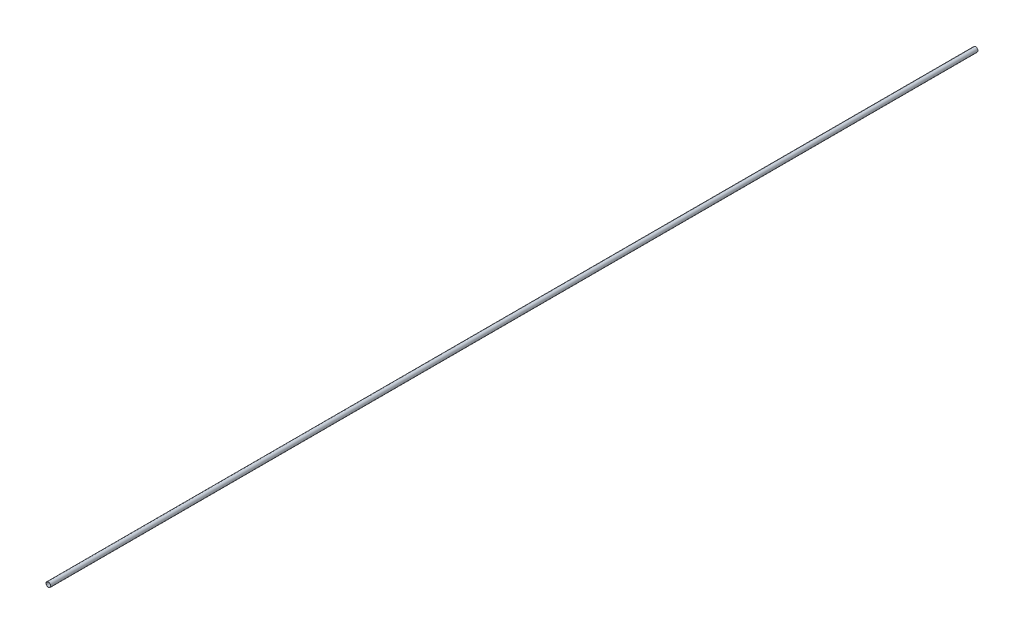
ISO-10303-21;
HEADER;
FILE_DESCRIPTION(('STEP AP214'),'2;1');
FILE_NAME('part.step','',(''),(''),'','','');
FILE_SCHEMA(('AUTOMOTIVE_DESIGN { 1 0 10303 214 1 1 1 1 }'));
ENDSEC;
DATA;
#1=APPLICATION_CONTEXT('core data for automotive mechanical design processes');
#2=APPLICATION_PROTOCOL_DEFINITION('international standard','automotive_design',2000,#1);
#3=PRODUCT_CONTEXT('',#1,'mechanical');
#4=PRODUCT('Part','Part','',(#3));
#5=PRODUCT_RELATED_PRODUCT_CATEGORY('part','',(#4));
#6=PRODUCT_DEFINITION_FORMATION('','',#4);
#7=PRODUCT_DEFINITION_CONTEXT('part definition',#1,'design');
#8=PRODUCT_DEFINITION('design','',#6,#7);
#9=PRODUCT_DEFINITION_SHAPE('','',#8);
#10=(LENGTH_UNIT() NAMED_UNIT(*) SI_UNIT(.MILLI.,.METRE.));
#11=(NAMED_UNIT(*) PLANE_ANGLE_UNIT() SI_UNIT($,.RADIAN.));
#12=(NAMED_UNIT(*) SI_UNIT($,.STERADIAN.) SOLID_ANGLE_UNIT());
#13=UNCERTAINTY_MEASURE_WITH_UNIT(LENGTH_MEASURE(1.E-05),#10,'distance_accuracy_value','');
#14=(GEOMETRIC_REPRESENTATION_CONTEXT(3) GLOBAL_UNCERTAINTY_ASSIGNED_CONTEXT((#13)) GLOBAL_UNIT_ASSIGNED_CONTEXT((#10,
#11,#12)) REPRESENTATION_CONTEXT('',''));
#15=CARTESIAN_POINT('',(0.,0.,0.));
#16=DIRECTION('',(0.,0.,1.));
#17=DIRECTION('',(1.,0.,0.));
#18=AXIS2_PLACEMENT_3D('',#15,#16,#17);
#19=CARTESIAN_POINT('',(2675.10583961434,3025.34596438199,1524.));
#20=DIRECTION('',(0.,0.,1.));
#21=DIRECTION('',(1.,0.,0.));
#22=AXIS2_PLACEMENT_3D('',#19,#20,#21);
#23=PLANE('',#22);
#24=CARTESIAN_POINT('',(2675.10583961434,3025.34596438199,1524.));
#25=DIRECTION('',(0.,0.,1.));
#26=DIRECTION('',(1.,0.,0.));
#27=AXIS2_PLACEMENT_3D('',#24,#25,#26);
#28=CIRCLE('',#27,3.88620000000017);
#29=CARTESIAN_POINT('',(2678.99203961434,3025.34596438199,1524.));
#30=VERTEX_POINT('',#29);
#31=EDGE_CURVE('E10',#30,#30,#28,.T.);
#32=ORIENTED_EDGE('',*,*,#31,.T.);
#33=EDGE_LOOP('',(#32));
#34=FACE_BOUND('',#33,.T.);
#35=CARTESIAN_POINT('',(2675.10583961434,3025.34596438199,1524.));
#36=DIRECTION('',(0.,0.,1.));
#37=DIRECTION('',(1.,0.,0.));
#38=AXIS2_PLACEMENT_3D('',#35,#36,#37);
#39=CIRCLE('',#38,3.53059999999994);
#40=CARTESIAN_POINT('',(2678.63643961434,3025.34596438199,1524.));
#41=VERTEX_POINT('',#40);
#42=EDGE_CURVE('E43',#41,#41,#39,.T.);
#43=ORIENTED_EDGE('',*,*,#42,.F.);
#44=EDGE_LOOP('',(#43));
#45=FACE_BOUND('',#44,.T.);
#46=ADVANCED_FACE('F32',(#34,#45),#23,.T.);
#47=CARTESIAN_POINT('',(2675.10583961434,3025.34596438199,0.));
#48=DIRECTION('',(0.,0.,1.));
#49=DIRECTION('',(1.,0.,0.));
#50=AXIS2_PLACEMENT_3D('',#47,#48,#49);
#51=PLANE('',#50);
#52=CARTESIAN_POINT('',(2675.10583961434,3025.34596438199,0.));
#53=DIRECTION('',(0.,0.,1.));
#54=DIRECTION('',(1.,0.,0.));
#55=AXIS2_PLACEMENT_3D('',#52,#53,#54);
#56=CIRCLE('',#55,3.88620000000017);
#57=CARTESIAN_POINT('',(2678.99203961434,3025.34596438199,0.));
#58=VERTEX_POINT('',#57);
#59=EDGE_CURVE('E36',#58,#58,#56,.T.);
#60=ORIENTED_EDGE('',*,*,#59,.F.);
#61=EDGE_LOOP('',(#60));
#62=FACE_BOUND('',#61,.T.);
#63=CARTESIAN_POINT('',(2675.10583961434,3025.34596438199,0.));
#64=DIRECTION('',(0.,0.,1.));
#65=DIRECTION('',(1.,0.,0.));
#66=AXIS2_PLACEMENT_3D('',#63,#64,#65);
#67=CIRCLE('',#66,3.53059999999994);
#68=CARTESIAN_POINT('',(2678.63643961434,3025.34596438199,0.));
#69=VERTEX_POINT('',#68);
#70=EDGE_CURVE('E45',#69,#69,#67,.T.);
#71=ORIENTED_EDGE('',*,*,#70,.T.);
#72=EDGE_LOOP('',(#71));
#73=FACE_BOUND('',#72,.T.);
#74=ADVANCED_FACE('F55',(#62,#73),#51,.F.);
#75=CARTESIAN_POINT('',(2675.10583961434,3025.34596438199,1524.));
#76=DIRECTION('',(0.,0.,-1.));
#77=DIRECTION('',(-1.,0.,0.));
#78=AXIS2_PLACEMENT_3D('',#75,#76,#77);
#79=CYLINDRICAL_SURFACE('',#78,3.88620000000017);
#80=ORIENTED_EDGE('',*,*,#31,.F.);
#81=EDGE_LOOP('',(#80));
#82=FACE_BOUND('',#81,.T.);
#83=ORIENTED_EDGE('',*,*,#59,.T.);
#84=EDGE_LOOP('',(#83));
#85=FACE_BOUND('',#84,.T.);
#86=ADVANCED_FACE('F34',(#82,#85),#79,.T.);
#87=CARTESIAN_POINT('',(2675.10583961434,3025.34596438199,1524.));
#88=DIRECTION('',(0.,0.,-1.));
#89=DIRECTION('',(-1.,0.,0.));
#90=AXIS2_PLACEMENT_3D('',#87,#88,#89);
#91=CYLINDRICAL_SURFACE('',#90,3.53059999999994);
#92=ORIENTED_EDGE('',*,*,#42,.T.);
#93=EDGE_LOOP('',(#92));
#94=FACE_BOUND('',#93,.T.);
#95=ORIENTED_EDGE('',*,*,#70,.F.);
#96=EDGE_LOOP('',(#95));
#97=FACE_BOUND('',#96,.T.);
#98=ADVANCED_FACE('F51',(#94,#97),#91,.F.);
#99=CLOSED_SHELL('',(#46,#74,#86,#98));
#100=MANIFOLD_SOLID_BREP('B2',#99);
#101=ADVANCED_BREP_SHAPE_REPRESENTATION('',(#18,#100),#14);
#102=SHAPE_DEFINITION_REPRESENTATION(#9,#101);
ENDSEC;
END-ISO-10303-21;
